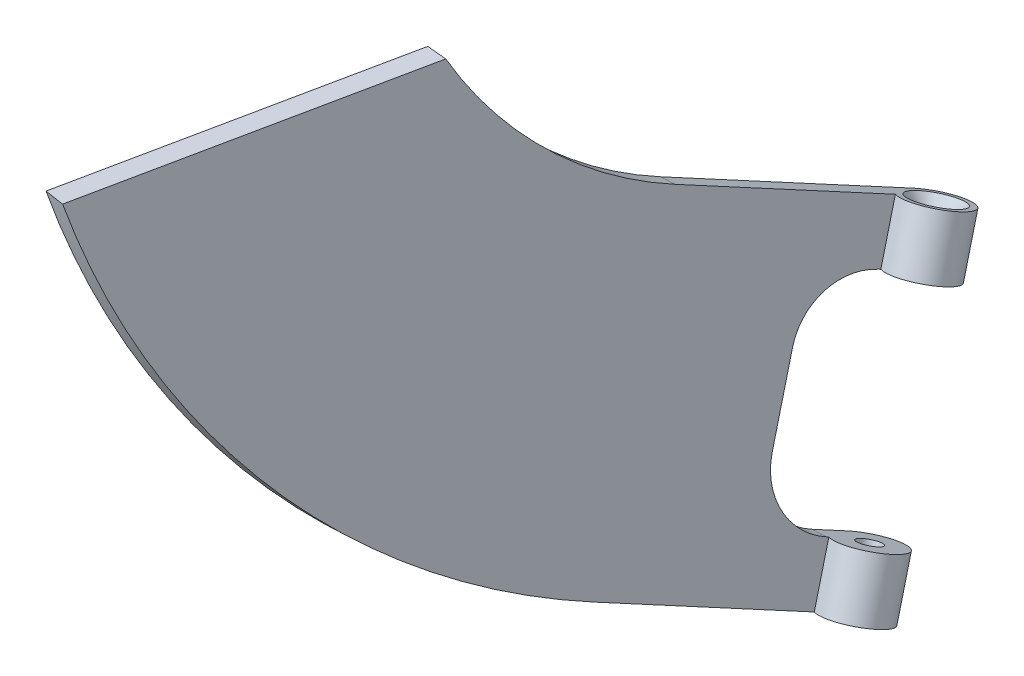
ISO-10303-21;
HEADER;
FILE_DESCRIPTION(('STEP AP214'),'2;1');
FILE_NAME('part.step','',(''),(''),'','','');
FILE_SCHEMA(('AUTOMOTIVE_DESIGN { 1 0 10303 214 1 1 1 1 }'));
ENDSEC;
DATA;
#1=APPLICATION_CONTEXT('core data for automotive mechanical design processes');
#2=APPLICATION_PROTOCOL_DEFINITION('international standard','automotive_design',2000,#1);
#3=PRODUCT_CONTEXT('',#1,'mechanical');
#4=PRODUCT('Part','Part','',(#3));
#5=PRODUCT_RELATED_PRODUCT_CATEGORY('part','',(#4));
#6=PRODUCT_DEFINITION_FORMATION('','',#4);
#7=PRODUCT_DEFINITION_CONTEXT('part definition',#1,'design');
#8=PRODUCT_DEFINITION('design','',#6,#7);
#9=PRODUCT_DEFINITION_SHAPE('','',#8);
#10=(LENGTH_UNIT() NAMED_UNIT(*) SI_UNIT(.MILLI.,.METRE.));
#11=(NAMED_UNIT(*) PLANE_ANGLE_UNIT() SI_UNIT($,.RADIAN.));
#12=(NAMED_UNIT(*) SI_UNIT($,.STERADIAN.) SOLID_ANGLE_UNIT());
#13=UNCERTAINTY_MEASURE_WITH_UNIT(LENGTH_MEASURE(1.E-05),#10,'distance_accuracy_value','');
#14=(GEOMETRIC_REPRESENTATION_CONTEXT(3) GLOBAL_UNCERTAINTY_ASSIGNED_CONTEXT((#13)) GLOBAL_UNIT_ASSIGNED_CONTEXT((#10,
#11,#12)) REPRESENTATION_CONTEXT('',''));
#15=CARTESIAN_POINT('',(0.,0.,0.));
#16=DIRECTION('',(0.,0.,1.));
#17=DIRECTION('',(1.,0.,0.));
#18=AXIS2_PLACEMENT_3D('',#15,#16,#17);
#19=CARTESIAN_POINT('',(-143.876180409885,-16.6312894965581,4.66813646127313));
#20=DIRECTION('',(0.139173100960059,-0.904654896047373,0.402778310025103));
#21=DIRECTION('',(0.,-0.406736643075801,-0.913545457642601));
#22=AXIS2_PLACEMENT_3D('',#19,#20,#21);
#23=CYLINDRICAL_SURFACE('',#22,2.50000000000002);
#24=DIRECTION('',(0.139173100960059,-0.904654896047373,0.402778310025103));
#25=VECTOR('',#24,1.);
#26=CARTESIAN_POINT('',(-146.255947317866,-17.2171083517496,4.17465319652708));
#27=LINE('',#26,#25);
#28=CARTESIAN_POINT('',(-145.903995960637,-19.5048673819839,5.19322914186103));
#29=VERTEX_POINT('',#28);
#30=CARTESIAN_POINT('',(-145.263799696221,-23.6662799038017,7.04600936797669));
#31=VERTEX_POINT('',#30);
#32=EDGE_CURVE('E262',#29,#31,#27,.T.);
#33=ORIENTED_EDGE('',*,*,#32,.F.);
#34=CARTESIAN_POINT('',(-143.524229052657,-18.9190485267924,5.68671240660709));
#35=DIRECTION('',(0.139173100960058,-0.904654896047373,0.402778310025103));
#36=DIRECTION('',(0.,0.406736643075801,0.913545457642601));
#37=AXIS2_PLACEMENT_3D('',#34,#35,#36);
#38=CIRCLE('',#37,2.50000000000002);
#39=CARTESIAN_POINT('',(-145.01757983081,-18.2997660660419,7.59364520227576));
#40=VERTEX_POINT('',#39);
#41=EDGE_CURVE('E266',#40,#29,#38,.F.);
#42=ORIENTED_EDGE('',*,*,#41,.F.);
#43=DIRECTION('',(0.139173100960059,-0.904654896047373,0.402778310025103));
#44=VECTOR('',#43,1.);
#45=CARTESIAN_POINT('',(-145.369531188038,-16.0120070358076,6.5750692569418));
#46=LINE('',#45,#44);
#47=CARTESIAN_POINT('',(-144.377383566394,-22.4611785878599,9.44642542839123));
#48=VERTEX_POINT('',#47);
#49=EDGE_CURVE('E284',#40,#48,#46,.T.);
#50=ORIENTED_EDGE('',*,*,#49,.T.);
#51=CARTESIAN_POINT('',(-142.884032788241,-23.0804610486104,7.53949263272256));
#52=DIRECTION('',(0.139173100960059,-0.904654896047373,0.402778310025103));
#53=DIRECTION('',(0.,0.4067366430758,0.913545457642601));
#54=AXIS2_PLACEMENT_3D('',#51,#52,#53);
#55=CIRCLE('',#54,2.50000000000002);
#56=EDGE_CURVE('E256',#48,#31,#55,.F.);
#57=ORIENTED_EDGE('',*,*,#56,.T.);
#58=EDGE_LOOP('',(#33,#42,#50,#57));
#59=FACE_BOUND('',#58,.T.);
#60=ADVANCED_FACE('F150',(#59),#23,.T.);
#61=CARTESIAN_POINT('',(-134.49047591331,-30.1983910002047,-29.0471408064683));
#62=DIRECTION('',(0.951906763192104,0.234327542076565,0.197393305898369));
#63=DIRECTION('',(0.239030618578229,-0.971012030503283,0.));
#64=AXIS2_PLACEMENT_3D('',#61,#62,#63);
#65=PLANE('',#64);
#66=DIRECTION('',(-0.272954872017871,0.355935558889348,0.893759204573489));
#67=VECTOR('',#66,1.);
#68=CARTESIAN_POINT('',(-145.787910415248,-20.6218391448091,14.0650326917154));
#69=LINE('',#68,#67);
#70=CARTESIAN_POINT('',(-144.423136055159,-22.4015169392559,9.5962366688477));
#71=VERTEX_POINT('',#70);
#72=EDGE_CURVE('E401',#48,#71,#69,.T.);
#73=ORIENTED_EDGE('',*,*,#72,.F.);
#74=ORIENTED_EDGE('',*,*,#49,.F.);
#75=DIRECTION('',(-0.272954872017871,0.355935558889349,0.893759204573489));
#76=VECTOR('',#75,1.);
#77=CARTESIAN_POINT('',(-143.913083879505,-19.7400385213845,3.9771007691407));
#78=LINE('',#77,#76);
#79=CARTESIAN_POINT('',(-149.303906088711,-12.7103588467854,21.6287255013843));
#80=VERTEX_POINT('',#79);
#81=EDGE_CURVE('E281',#40,#80,#78,.T.);
#82=ORIENTED_EDGE('',*,*,#81,.T.);
#83=CARTESIAN_POINT('',(-152.991851090817,11.2620717414086,10.9555117469525));
#84=DIRECTION('',(-0.9519067631921,-0.23432754207657,-0.197393305898382));
#85=DIRECTION('',(0.239030618578235,-0.971012030503282,0.));
#86=AXIS2_PLACEMENT_3D('',#83,#84,#85);
#87=CIRCLE('',#86,26.4989784424255);
#88=CARTESIAN_POINT('',(-155.1729315601,0.,34.8428407430962));
#89=VERTEX_POINT('',#88);
#90=EDGE_CURVE('E421',#80,#89,#87,.T.);
#91=ORIENTED_EDGE('',*,*,#90,.T.);
#92=DIRECTION('',(0.203046588965361,0.,-0.979169077692679));
#93=VECTOR('',#92,1.);
#94=CARTESIAN_POINT('',(-141.617826281391,0.,-30.5251125006011));
#95=LINE('',#94,#93);
#96=CARTESIAN_POINT('',(-160.647492494551,0.,61.2432880900472));
#97=VERTEX_POINT('',#96);
#98=EDGE_CURVE('E407',#97,#89,#95,.T.);
#99=ORIENTED_EDGE('',*,*,#98,.F.);
#100=CARTESIAN_POINT('',(-152.991851090817,11.2620717414086,10.9555117469525));
#101=DIRECTION('',(-0.9519067631921,-0.23432754207657,-0.197393305898382));
#102=DIRECTION('',(0.239030618578235,-0.971012030503282,0.));
#103=AXIS2_PLACEMENT_3D('',#100,#101,#102);
#104=CIRCLE('',#103,52.0989784424254);
#105=CARTESIAN_POINT('',(-145.741074704133,-35.8695241855986,31.9398502380258));
#106=VERTEX_POINT('',#105);
#107=EDGE_CURVE('E435',#106,#97,#104,.T.);
#108=ORIENTED_EDGE('',*,*,#107,.F.);
#109=DIRECTION('',(0.272954872017871,-0.355935558889349,-0.893759204573488));
#110=VECTOR('',#109,1.);
#111=CARTESIAN_POINT('',(-130.575693171505,-55.6453153692518,-17.7174401244917));
#112=LINE('',#111,#110);
#113=CARTESIAN_POINT('',(-141.454748446233,-41.4589314048547,17.9047699389184));
#114=VERTEX_POINT('',#113);
#115=EDGE_CURVE('E274',#106,#114,#112,.T.);
#116=ORIENTED_EDGE('',*,*,#115,.T.);
#117=CARTESIAN_POINT('',(-142.094944710649,-37.2975188830368,16.0519897128029));
#118=VERTEX_POINT('',#117);
#119=EDGE_CURVE('E277',#118,#114,#46,.T.);
#120=ORIENTED_EDGE('',*,*,#119,.F.);
#121=DIRECTION('',(0.272954872017871,-0.355935558889349,-0.893759204573488));
#122=VECTOR('',#121,1.);
#123=CARTESIAN_POINT('',(-143.505471559503,-35.458179439986,20.6705969761271));
#124=LINE('',#123,#122);
#125=CARTESIAN_POINT('',(-142.140697199414,-37.2378572344329,16.2018009532594));
#126=VERTEX_POINT('',#125);
#127=EDGE_CURVE('E252',#126,#118,#124,.T.);
#128=ORIENTED_EDGE('',*,*,#127,.F.);
#129=CARTESIAN_POINT('',(-142.836562704214,-32.714582754196,14.1879094031339));
#130=DIRECTION('',(-0.951906763192104,-0.234327542076565,-0.197393305898369));
#131=DIRECTION('',(0.239030618578229,-0.971012030503283,0.));
#132=AXIS2_PLACEMENT_3D('',#129,#130,#131);
#133=CIRCLE('',#132,5.);
#134=CARTESIAN_POINT('',(-144.201337064303,-30.9349049597493,18.6567054260013));
#135=VERTEX_POINT('',#134);
#136=EDGE_CURVE('E310',#135,#126,#133,.F.);
#137=ORIENTED_EDGE('',*,*,#136,.F.);
#138=DIRECTION('',(0.139173100960059,-0.904654896047373,0.402778310025103));
#139=VECTOR('',#138,1.);
#140=CARTESIAN_POINT('',(-145.787910415248,-20.6218391448092,14.0650326917151));
#141=LINE('',#140,#139);
#142=CARTESIAN_POINT('',(-145.092044910448,-25.1451136250461,16.0789242418407));
#143=VERTEX_POINT('',#142);
#144=EDGE_CURVE('E398',#143,#135,#141,.T.);
#145=ORIENTED_EDGE('',*,*,#144,.F.);
#146=CARTESIAN_POINT('',(-143.727270550358,-26.9247914194928,11.6101282189732));
#147=DIRECTION('',(-0.951906763192104,-0.234327542076565,-0.197393305898369));
#148=DIRECTION('',(0.239030618578229,-0.971012030503283,0.));
#149=AXIS2_PLACEMENT_3D('',#146,#147,#148);
#150=CIRCLE('',#149,5.);
#151=EDGE_CURVE('E306',#71,#143,#150,.F.);
#152=ORIENTED_EDGE('',*,*,#151,.F.);
#153=EDGE_LOOP('',(#73,#74,#82,#91,#99,#108,#116,#120,#128,#137,#145,#152));
#154=FACE_BOUND('',#153,.T.);
#155=ADVANCED_FACE('F347',(#154),#65,.T.);
#156=CARTESIAN_POINT('',(-154.514901911924,10.8871476740861,10.6396824575151));
#157=DIRECTION('',(0.95190676319209,0.234327542076584,0.197393305898416));
#158=DIRECTION('',(0.239030618578252,-0.971012030503278,0.));
#159=AXIS2_PLACEMENT_3D('',#156,#157,#158);
#160=CYLINDRICAL_SURFACE('',#159,26.4989784424255);
#161=CARTESIAN_POINT('',(-198.741668475483,0.,1.46854511639221));
#162=DIRECTION('',(0.,-1.,0.));
#163=DIRECTION('',(0.979169077692669,0.,0.203046588965411));
#164=AXIS2_PLACEMENT_3D('',#161,#162,#163);
#165=ELLIPSE('',#164,113.085206321009,26.4989784424255);
#166=CARTESIAN_POINT('',(-156.821757636685,0.,34.6884722540913));
#167=VERTEX_POINT('',#166);
#168=EDGE_CURVE('E410',#167,#89,#165,.F.);
#169=ORIENTED_EDGE('',*,*,#168,.T.);
#170=ORIENTED_EDGE('',*,*,#90,.F.);
#171=DIRECTION('',(0.95190676319209,0.234327542076584,0.197393305898416));
#172=VECTOR('',#171,1.);
#173=CARTESIAN_POINT('',(-150.826956909818,-13.0852829141079,21.3128962119468));
#174=LINE('',#173,#172);
#175=CARTESIAN_POINT('',(-150.826956909818,-13.0852829141079,21.3128962119468));
#176=VERTEX_POINT('',#175);
#177=EDGE_CURVE('E412',#176,#80,#174,.T.);
#178=ORIENTED_EDGE('',*,*,#177,.F.);
#179=CARTESIAN_POINT('',(-154.514901911924,10.8871476740861,10.6396824575151));
#180=DIRECTION('',(-0.9519067631921,-0.23432754207657,-0.197393305898382));
#181=DIRECTION('',(0.239030618578235,-0.971012030503282,0.));
#182=AXIS2_PLACEMENT_3D('',#179,#180,#181);
#183=CIRCLE('',#182,26.4989784424255);
#184=EDGE_CURVE('E278',#176,#167,#183,.T.);
#185=ORIENTED_EDGE('',*,*,#184,.T.);
#186=EDGE_LOOP('',(#169,#170,#178,#185));
#187=FACE_BOUND('',#186,.T.);
#188=ADVANCED_FACE('F353',(#187),#160,.F.);
#189=CARTESIAN_POINT('',(-154.514901911924,10.8871476740861,10.6396824575151));
#190=DIRECTION('',(0.95190676319209,0.234327542076584,0.197393305898416));
#191=DIRECTION('',(0.239030618578252,-0.971012030503278,0.));
#192=AXIS2_PLACEMENT_3D('',#189,#190,#191);
#193=CYLINDRICAL_SURFACE('',#192,52.0989784424254);
#194=CARTESIAN_POINT('',(-154.514901911924,10.8871476740861,10.6396824575151));
#195=DIRECTION('',(-0.9519067631921,-0.23432754207657,-0.197393305898382));
#196=DIRECTION('',(0.239030618578235,-0.971012030503282,0.));
#197=AXIS2_PLACEMENT_3D('',#194,#195,#196);
#198=CIRCLE('',#197,52.0989784424254);
#199=CARTESIAN_POINT('',(-147.26412552524,-36.2444482529211,31.6240209485883));
#200=VERTEX_POINT('',#199);
#201=CARTESIAN_POINT('',(-162.276579120215,0.,60.9937283444271));
#202=VERTEX_POINT('',#201);
#203=EDGE_CURVE('E426',#200,#202,#198,.T.);
#204=ORIENTED_EDGE('',*,*,#203,.F.);
#205=DIRECTION('',(0.95190676319209,0.234327542076584,0.197393305898416));
#206=VECTOR('',#205,1.);
#207=CARTESIAN_POINT('',(-147.26412552524,-36.2444482529211,31.6240209485883));
#208=LINE('',#207,#206);
#209=EDGE_CURVE('E416',#200,#106,#208,.T.);
#210=ORIENTED_EDGE('',*,*,#209,.T.);
#211=ORIENTED_EDGE('',*,*,#107,.T.);
#212=CARTESIAN_POINT('',(-198.741668475483,0.,1.46854511639221));
#213=DIRECTION('',(0.,-1.,0.));
#214=DIRECTION('',(0.979169077692669,0.,0.203046588965411));
#215=AXIS2_PLACEMENT_3D('',#212,#213,#214);
#216=ELLIPSE('',#215,222.333994462324,52.0989784424254);
#217=EDGE_CURVE('E290',#202,#97,#216,.F.);
#218=ORIENTED_EDGE('',*,*,#217,.F.);
#219=EDGE_LOOP('',(#204,#210,#211,#218));
#220=FACE_BOUND('',#219,.T.);
#221=ADVANCED_FACE('F370',(#220),#193,.T.);
#222=CARTESIAN_POINT('',(-142.437067839933,-43.4129078588149,13.8554904988706));
#223=DIRECTION('',(0.139173100960059,-0.904654896047373,0.402778310025103));
#224=DIRECTION('',(0.,-0.406736643075801,-0.913545457642601));
#225=AXIS2_PLACEMENT_3D('',#222,#223,#224);
#226=PLANE('',#225);
#227=CARTESIAN_POINT('',(-139.96139766808,-42.0782138656052,15.9978371432497));
#228=DIRECTION('',(-0.139173100960059,0.904654896047373,-0.402778310025103));
#229=DIRECTION('',(0.,-0.406736643075801,-0.913545457642601));
#230=AXIS2_PLACEMENT_3D('',#227,#228,#229);
#231=CIRCLE('',#230,2.00000000000002);
#232=CARTESIAN_POINT('',(-139.96139766808,-42.8916871517568,14.1707462279645));
#233=VERTEX_POINT('',#232);
#234=EDGE_CURVE('E13',#233,#233,#231,.F.);
#235=ORIENTED_EDGE('',*,*,#234,.F.);
#236=EDGE_LOOP('',(#235));
#237=FACE_BOUND('',#236,.T.);
#238=ORIENTED_EDGE('',*,*,#115,.F.);
#239=ORIENTED_EDGE('',*,*,#209,.F.);
#240=DIRECTION('',(-0.272954872017901,0.355935558889341,0.893759204573482));
#241=VECTOR('',#240,1.);
#242=CARTESIAN_POINT('',(-132.09874399261,-56.0202394365756,-18.0332694139329));
#243=LINE('',#242,#241);
#244=CARTESIAN_POINT('',(-142.34116457606,-42.6640327207967,15.5043538785037));
#245=VERTEX_POINT('',#244);
#246=EDGE_CURVE('E263',#245,#200,#243,.T.);
#247=ORIENTED_EDGE('',*,*,#246,.F.);
#248=CARTESIAN_POINT('',(-139.96139766808,-42.0782138656052,15.9978371432497));
#249=DIRECTION('',(-0.139173100960059,0.904654896047373,-0.402778310025103));
#250=DIRECTION('',(0.,-0.406736643075801,-0.913545457642601));
#251=AXIS2_PLACEMENT_3D('',#248,#249,#250);
#252=CIRCLE('',#251,2.50000000000002);
#253=EDGE_CURVE('E260',#245,#114,#252,.F.);
#254=ORIENTED_EDGE('',*,*,#253,.T.);
#255=EDGE_LOOP('',(#238,#239,#247,#254));
#256=FACE_BOUND('',#255,.T.);
#257=ADVANCED_FACE('F364',(#237,#256),#226,.T.);
#258=CARTESIAN_POINT('',(-145.999899224511,-20.2537425200022,3.54436576222795));
#259=DIRECTION('',(-0.139173100960058,0.904654896047373,-0.402778310025103));
#260=DIRECTION('',(0.,0.406736643075801,0.913545457642601));
#261=AXIS2_PLACEMENT_3D('',#258,#259,#260);
#262=PLANE('',#261);
#263=CARTESIAN_POINT('',(-143.524229052657,-18.9190485267925,5.68671240660708));
#264=DIRECTION('',(0.139173100960058,-0.904654896047373,0.402778310025103));
#265=DIRECTION('',(0.,0.406736643075801,0.913545457642601));
#266=AXIS2_PLACEMENT_3D('',#263,#264,#265);
#267=CIRCLE('',#266,2.00000000000005);
#268=CARTESIAN_POINT('',(-143.524229052657,-18.1055752406408,7.51380332189233));
#269=VERTEX_POINT('',#268);
#270=EDGE_CURVE('E318',#269,#269,#267,.F.);
#271=ORIENTED_EDGE('',*,*,#270,.F.);
#272=EDGE_LOOP('',(#271));
#273=FACE_BOUND('',#272,.T.);
#274=ORIENTED_EDGE('',*,*,#81,.F.);
#275=ORIENTED_EDGE('',*,*,#41,.T.);
#276=DIRECTION('',(0.272954872017901,-0.355935558889341,-0.893759204573482));
#277=VECTOR('',#276,1.);
#278=CARTESIAN_POINT('',(-145.436134700612,-20.114962588707,3.66127147970337));
#279=LINE('',#278,#277);
#280=EDGE_CURVE('E273',#176,#29,#279,.T.);
#281=ORIENTED_EDGE('',*,*,#280,.F.);
#282=ORIENTED_EDGE('',*,*,#177,.T.);
#283=EDGE_LOOP('',(#274,#275,#281,#282));
#284=FACE_BOUND('',#283,.T.);
#285=ADVANCED_FACE('F359',(#273,#284),#262,.T.);
#286=ORIENTED_EDGE('',*,*,#119,.T.);
#287=ORIENTED_EDGE('',*,*,#253,.F.);
#288=CARTESIAN_POINT('',(-142.981360840476,-38.5026201989788,13.6515736523882));
#289=VERTEX_POINT('',#288);
#290=EDGE_CURVE('E242',#289,#245,#27,.T.);
#291=ORIENTED_EDGE('',*,*,#290,.F.);
#292=CARTESIAN_POINT('',(-140.601593932496,-37.9168013437873,14.1450569171343));
#293=DIRECTION('',(-0.139173100960059,0.904654896047373,-0.402778310025104));
#294=DIRECTION('',(0.,-0.406736643075801,-0.913545457642601));
#295=AXIS2_PLACEMENT_3D('',#292,#293,#294);
#296=CIRCLE('',#295,2.50000000000002);
#297=EDGE_CURVE('E249',#289,#118,#296,.F.);
#298=ORIENTED_EDGE('',*,*,#297,.T.);
#299=EDGE_LOOP('',(#286,#287,#291,#298));
#300=FACE_BOUND('',#299,.T.);
#301=ADVANCED_FACE('F259',(#300),#23,.T.);
#302=CARTESIAN_POINT('',(-136.013526734415,-30.5733150675285,-29.3629700959095));
#303=DIRECTION('',(-0.951906763192096,-0.234327542076576,-0.197393305898397));
#304=DIRECTION('',(-0.239030618578242,0.97101203050328,0.));
#305=AXIS2_PLACEMENT_3D('',#302,#303,#304);
#306=PLANE('',#305);
#307=DIRECTION('',(-0.272954872017883,0.355935558889345,0.893759204573486));
#308=VECTOR('',#307,1.);
#309=CARTESIAN_POINT('',(-147.310961236355,-20.9967632121316,13.7492034022779));
#310=LINE('',#309,#308);
#311=CARTESIAN_POINT('',(-145.946186876265,-22.7764410065783,9.28040737941043));
#312=VERTEX_POINT('',#311);
#313=EDGE_CURVE('E246',#31,#312,#310,.T.);
#314=ORIENTED_EDGE('',*,*,#313,.T.);
#315=CARTESIAN_POINT('',(-145.250321371466,-27.2997154868153,11.2942989295358));
#316=DIRECTION('',(0.951906763192096,0.234327542076576,0.197393305898397));
#317=DIRECTION('',(-0.239030618578242,0.97101203050328,0.));
#318=AXIS2_PLACEMENT_3D('',#315,#316,#317);
#319=CIRCLE('',#318,5.);
#320=CARTESIAN_POINT('',(-146.615095731554,-25.5200376923684,15.7630949524034));
#321=VERTEX_POINT('',#320);
#322=EDGE_CURVE('E303',#321,#312,#319,.F.);
#323=ORIENTED_EDGE('',*,*,#322,.F.);
#324=DIRECTION('',(0.139173100960057,-0.904654896047373,0.402778310025103));
#325=VECTOR('',#324,1.);
#326=CARTESIAN_POINT('',(-147.310961236355,-20.9967632121316,13.7492034022779));
#327=LINE('',#326,#325);
#328=CARTESIAN_POINT('',(-145.72438788541,-31.3098290270716,18.340876136564));
#329=VERTEX_POINT('',#328);
#330=EDGE_CURVE('E247',#321,#329,#327,.T.);
#331=ORIENTED_EDGE('',*,*,#330,.T.);
#332=CARTESIAN_POINT('',(-144.359613525321,-33.0895068215185,13.8720801136965));
#333=DIRECTION('',(0.951906763192096,0.234327542076576,0.197393305898397));
#334=DIRECTION('',(-0.239030618578242,0.97101203050328,0.));
#335=AXIS2_PLACEMENT_3D('',#332,#333,#334);
#336=CIRCLE('',#335,5.);
#337=CARTESIAN_POINT('',(-143.66374802052,-37.6127813017552,15.8859716638221));
#338=VERTEX_POINT('',#337);
#339=EDGE_CURVE('E245',#338,#329,#336,.F.);
#340=ORIENTED_EDGE('',*,*,#339,.F.);
#341=DIRECTION('',(0.272954872017886,-0.355935558889345,-0.893759204573485));
#342=VECTOR('',#341,1.);
#343=CARTESIAN_POINT('',(-145.02852238061,-35.8331035073085,20.3547676866896));
#344=LINE('',#343,#342);
#345=EDGE_CURVE('E237',#338,#289,#344,.T.);
#346=ORIENTED_EDGE('',*,*,#345,.T.);
#347=ORIENTED_EDGE('',*,*,#290,.T.);
#348=ORIENTED_EDGE('',*,*,#246,.T.);
#349=ORIENTED_EDGE('',*,*,#203,.T.);
#350=DIRECTION('',(-0.203046588965478,0.,0.979169077692655));
#351=VECTOR('',#350,1.);
#352=CARTESIAN_POINT('',(-156.821757636685,0.,34.6884722540913));
#353=LINE('',#352,#351);
#354=EDGE_CURVE('E424',#167,#202,#353,.T.);
#355=ORIENTED_EDGE('',*,*,#354,.F.);
#356=ORIENTED_EDGE('',*,*,#184,.F.);
#357=ORIENTED_EDGE('',*,*,#280,.T.);
#358=ORIENTED_EDGE('',*,*,#32,.T.);
#359=EDGE_LOOP('',(#314,#323,#331,#340,#346,#347,#348,#349,#355,#356,#357,#358));
#360=FACE_BOUND('',#359,.T.);
#361=ADVANCED_FACE('F240',(#360),#306,.T.);
#362=CARTESIAN_POINT('',(0.,0.,0.));
#363=DIRECTION('',(0.,1.,0.));
#364=DIRECTION('',(0.,0.,1.));
#365=AXIS2_PLACEMENT_3D('',#362,#363,#364);
#366=PLANE('',#365);
#367=ORIENTED_EDGE('',*,*,#354,.T.);
#368=ORIENTED_EDGE('',*,*,#217,.T.);
#369=ORIENTED_EDGE('',*,*,#98,.T.);
#370=ORIENTED_EDGE('',*,*,#168,.F.);
#371=EDGE_LOOP('',(#367,#368,#369,#370));
#372=FACE_BOUND('',#371,.T.);
#373=ADVANCED_FACE('F343',(#372),#366,.T.);
#374=CARTESIAN_POINT('',(-124.799076917866,-15.4550917755572,18.4174077259105));
#375=DIRECTION('',(-0.139173100960059,0.904654896047373,-0.402778310025103));
#376=DIRECTION('',(0.,0.4067366430758,0.913545457642601));
#377=AXIS2_PLACEMENT_3D('',#374,#375,#376);
#378=PLANE('',#377);
#379=CARTESIAN_POINT('',(-142.884032788241,-23.0804610486104,7.53949263272256));
#380=DIRECTION('',(0.139173100960059,-0.904654896047373,0.402778310025103));
#381=DIRECTION('',(0.,0.4067366430758,0.913545457642601));
#382=AXIS2_PLACEMENT_3D('',#379,#380,#381);
#383=CIRCLE('',#382,0.90000000000002);
#384=CARTESIAN_POINT('',(-142.884032788241,-22.7143980698421,8.36168354460091));
#385=VERTEX_POINT('',#384);
#386=EDGE_CURVE('E257',#385,#385,#383,.T.);
#387=ORIENTED_EDGE('',*,*,#386,.F.);
#388=EDGE_LOOP('',(#387));
#389=FACE_BOUND('',#388,.T.);
#390=ORIENTED_EDGE('',*,*,#313,.F.);
#391=ORIENTED_EDGE('',*,*,#56,.F.);
#392=ORIENTED_EDGE('',*,*,#72,.T.);
#393=DIRECTION('',(-0.9519067631921,-0.23432754207657,-0.197393305898382));
#394=VECTOR('',#393,1.);
#395=CARTESIAN_POINT('',(-144.423136055158,-22.4015169392559,9.59623666884772));
#396=LINE('',#395,#394);
#397=EDGE_CURVE('E300',#312,#71,#396,.F.);
#398=ORIENTED_EDGE('',*,*,#397,.F.);
#399=EDGE_LOOP('',(#390,#391,#392,#398));
#400=FACE_BOUND('',#399,.T.);
#401=ADVANCED_FACE('F334',(#389,#400),#378,.F.);
#402=CARTESIAN_POINT('',(-122.516638062121,-30.2914320707342,25.0229720103222));
#403=DIRECTION('',(0.139173100960059,-0.904654896047373,0.402778310025104));
#404=DIRECTION('',(0.,-0.406736643075801,-0.913545457642601));
#405=AXIS2_PLACEMENT_3D('',#402,#403,#404);
#406=PLANE('',#405);
#407=CARTESIAN_POINT('',(-140.601593932496,-37.9168013437873,14.1450569171343));
#408=DIRECTION('',(-0.139173100960059,0.904654896047373,-0.402778310025104));
#409=DIRECTION('',(0.,-0.406736643075801,-0.913545457642601));
#410=AXIS2_PLACEMENT_3D('',#407,#408,#409);
#411=CIRCLE('',#410,0.90000000000002);
#412=CARTESIAN_POINT('',(-140.601593932496,-38.2828643225555,13.3228660052559));
#413=VERTEX_POINT('',#412);
#414=EDGE_CURVE('E313',#413,#413,#411,.T.);
#415=ORIENTED_EDGE('',*,*,#414,.F.);
#416=EDGE_LOOP('',(#415));
#417=FACE_BOUND('',#416,.T.);
#418=ORIENTED_EDGE('',*,*,#127,.T.);
#419=ORIENTED_EDGE('',*,*,#297,.F.);
#420=ORIENTED_EDGE('',*,*,#345,.F.);
#421=DIRECTION('',(-0.9519067631921,-0.23432754207657,-0.197393305898382));
#422=VECTOR('',#421,1.);
#423=CARTESIAN_POINT('',(-143.66374802052,-37.6127813017552,15.8859716638221));
#424=LINE('',#423,#422);
#425=EDGE_CURVE('E165',#126,#338,#424,.T.);
#426=ORIENTED_EDGE('',*,*,#425,.F.);
#427=EDGE_LOOP('',(#418,#419,#420,#426));
#428=FACE_BOUND('',#427,.T.);
#429=ADVANCED_FACE('F250',(#417,#428),#406,.F.);
#430=CARTESIAN_POINT('',(-124.799076917866,-15.4550917755572,18.4174077259105));
#431=DIRECTION('',(-0.272954872017885,0.355935558889345,0.893759204573486));
#432=DIRECTION('',(0.,-0.929037703397889,0.369985061408129));
#433=AXIS2_PLACEMENT_3D('',#430,#431,#432);
#434=PLANE('',#433);
#435=ORIENTED_EDGE('',*,*,#144,.T.);
#436=DIRECTION('',(-0.9519067631921,-0.23432754207657,-0.197393305898382));
#437=VECTOR('',#436,1.);
#438=CARTESIAN_POINT('',(-144.201337064303,-30.9349049597493,18.6567054260013));
#439=LINE('',#438,#437);
#440=EDGE_CURVE('E294',#329,#135,#439,.F.);
#441=ORIENTED_EDGE('',*,*,#440,.F.);
#442=ORIENTED_EDGE('',*,*,#330,.F.);
#443=DIRECTION('',(-0.9519067631921,-0.23432754207657,-0.197393305898382));
#444=VECTOR('',#443,1.);
#445=CARTESIAN_POINT('',(-146.615095731555,-25.5200376923686,15.7630949524032));
#446=LINE('',#445,#444);
#447=EDGE_CURVE('E298',#143,#321,#446,.T.);
#448=ORIENTED_EDGE('',*,*,#447,.F.);
#449=EDGE_LOOP('',(#435,#441,#442,#448));
#450=FACE_BOUND('',#449,.T.);
#451=ADVANCED_FACE('F333',(#450),#434,.F.);
#452=CARTESIAN_POINT('',(-122.738437052976,-21.7580440502408,15.9625032531686));
#453=DIRECTION('',(0.9519067631921,0.23432754207657,0.197393305898382));
#454=DIRECTION('',(0.239030618578235,-0.971012030503282,0.));
#455=AXIS2_PLACEMENT_3D('',#452,#453,#454);
#456=CYLINDRICAL_SURFACE('',#455,5.);
#457=ORIENTED_EDGE('',*,*,#151,.T.);
#458=ORIENTED_EDGE('',*,*,#447,.T.);
#459=ORIENTED_EDGE('',*,*,#322,.T.);
#460=ORIENTED_EDGE('',*,*,#397,.T.);
#461=EDGE_LOOP('',(#457,#458,#459,#460));
#462=FACE_BOUND('',#461,.T.);
#463=ADVANCED_FACE('F340',(#462),#456,.F.);
#464=CARTESIAN_POINT('',(-121.847729206832,-27.547835384944,18.5402844373292));
#465=DIRECTION('',(0.9519067631921,0.23432754207657,0.197393305898382));
#466=DIRECTION('',(0.239030618578235,-0.971012030503282,0.));
#467=AXIS2_PLACEMENT_3D('',#464,#465,#466);
#468=CYLINDRICAL_SURFACE('',#467,5.);
#469=ORIENTED_EDGE('',*,*,#136,.T.);
#470=ORIENTED_EDGE('',*,*,#425,.T.);
#471=ORIENTED_EDGE('',*,*,#339,.T.);
#472=ORIENTED_EDGE('',*,*,#440,.T.);
#473=EDGE_LOOP('',(#469,#470,#471,#472));
#474=FACE_BOUND('',#473,.T.);
#475=ADVANCED_FACE('F328',(#474),#468,.F.);
#476=CARTESIAN_POINT('',(-146.397707565405,-0.240824162227475,-2.62936887112607));
#477=DIRECTION('',(0.139173100960059,-0.904654896047373,0.402778310025103));
#478=DIRECTION('',(0.,-0.406736643075801,-0.913545457642601));
#479=AXIS2_PLACEMENT_3D('',#476,#477,#478);
#480=CYLINDRICAL_SURFACE('',#479,0.90000000000002);
#481=CARTESIAN_POINT('',(-140.114488079136,-41.0830934799531,15.5547810022221));
#482=DIRECTION('',(-0.139173100960064,0.904654896047372,-0.402778310025104));
#483=DIRECTION('',(0.,-0.406736643075802,-0.9135454576426));
#484=AXIS2_PLACEMENT_3D('',#481,#482,#483);
#485=CIRCLE('',#484,0.90000000000002);
#486=CARTESIAN_POINT('',(-140.114488079136,-41.4491564587213,14.7325900903437));
#487=VERTEX_POINT('',#486);
#488=EDGE_CURVE('E158',#487,#487,#485,.T.);
#489=ORIENTED_EDGE('',*,*,#488,.F.);
#490=EDGE_LOOP('',(#489));
#491=FACE_BOUND('',#490,.T.);
#492=ORIENTED_EDGE('',*,*,#414,.T.);
#493=EDGE_LOOP('',(#492));
#494=FACE_BOUND('',#493,.T.);
#495=ADVANCED_FACE('F324',(#491,#494),#480,.F.);
#496=CARTESIAN_POINT('',(-143.371138641601,-19.9141689124446,6.1297685476347));
#497=DIRECTION('',(0.139173100960039,-0.904654896047376,0.402778310025103));
#498=DIRECTION('',(0.,0.4067366430758,0.913545457642601));
#499=AXIS2_PLACEMENT_3D('',#496,#497,#498);
#500=CIRCLE('',#499,0.90000000000002);
#501=CARTESIAN_POINT('',(-143.371138641601,-19.5481059336764,6.95195945951306));
#502=VERTEX_POINT('',#501);
#503=EDGE_CURVE('E312',#502,#502,#500,.T.);
#504=ORIENTED_EDGE('',*,*,#503,.F.);
#505=EDGE_LOOP('',(#504));
#506=FACE_BOUND('',#505,.T.);
#507=ORIENTED_EDGE('',*,*,#386,.T.);
#508=EDGE_LOOP('',(#507));
#509=FACE_BOUND('',#508,.T.);
#510=ADVANCED_FACE('F327',(#506,#509),#480,.F.);
#511=CARTESIAN_POINT('',(-143.371138641601,-19.9141689124446,6.1297685476347));
#512=DIRECTION('',(-0.139173100960039,0.904654896047376,-0.402778310025103));
#513=DIRECTION('',(0.,0.4067366430758,0.913545457642601));
#514=AXIS2_PLACEMENT_3D('',#511,#512,#513);
#515=CONICAL_SURFACE('',#514,0.90000000000002,0.785398163397454);
#516=ORIENTED_EDGE('',*,*,#270,.T.);
#517=EDGE_LOOP('',(#516));
#518=FACE_BOUND('',#517,.T.);
#519=ORIENTED_EDGE('',*,*,#503,.T.);
#520=EDGE_LOOP('',(#519));
#521=FACE_BOUND('',#520,.T.);
#522=ADVANCED_FACE('F380',(#518,#521),#515,.F.);
#523=CARTESIAN_POINT('',(-140.114488079136,-41.0830934799531,15.5547810022221));
#524=DIRECTION('',(0.139173100960064,-0.904654896047372,0.402778310025104));
#525=DIRECTION('',(0.,-0.406736643075802,-0.9135454576426));
#526=AXIS2_PLACEMENT_3D('',#523,#524,#525);
#527=CONICAL_SURFACE('',#526,0.90000000000002,0.785398163397444);
#528=ORIENTED_EDGE('',*,*,#234,.T.);
#529=EDGE_LOOP('',(#528));
#530=FACE_BOUND('',#529,.T.);
#531=ORIENTED_EDGE('',*,*,#488,.T.);
#532=EDGE_LOOP('',(#531));
#533=FACE_BOUND('',#532,.T.);
#534=ADVANCED_FACE('F152',(#530,#533),#527,.F.);
#535=CLOSED_SHELL('',(#60,#155,#188,#221,#257,#285,#301,#361,#373,#401,#429,#451,#463,#475,#495,
#510,#522,#534));
#536=MANIFOLD_SOLID_BREP('B2',#535);
#537=ADVANCED_BREP_SHAPE_REPRESENTATION('',(#18,#536),#14);
#538=SHAPE_DEFINITION_REPRESENTATION(#9,#537);
ENDSEC;
END-ISO-10303-21;
